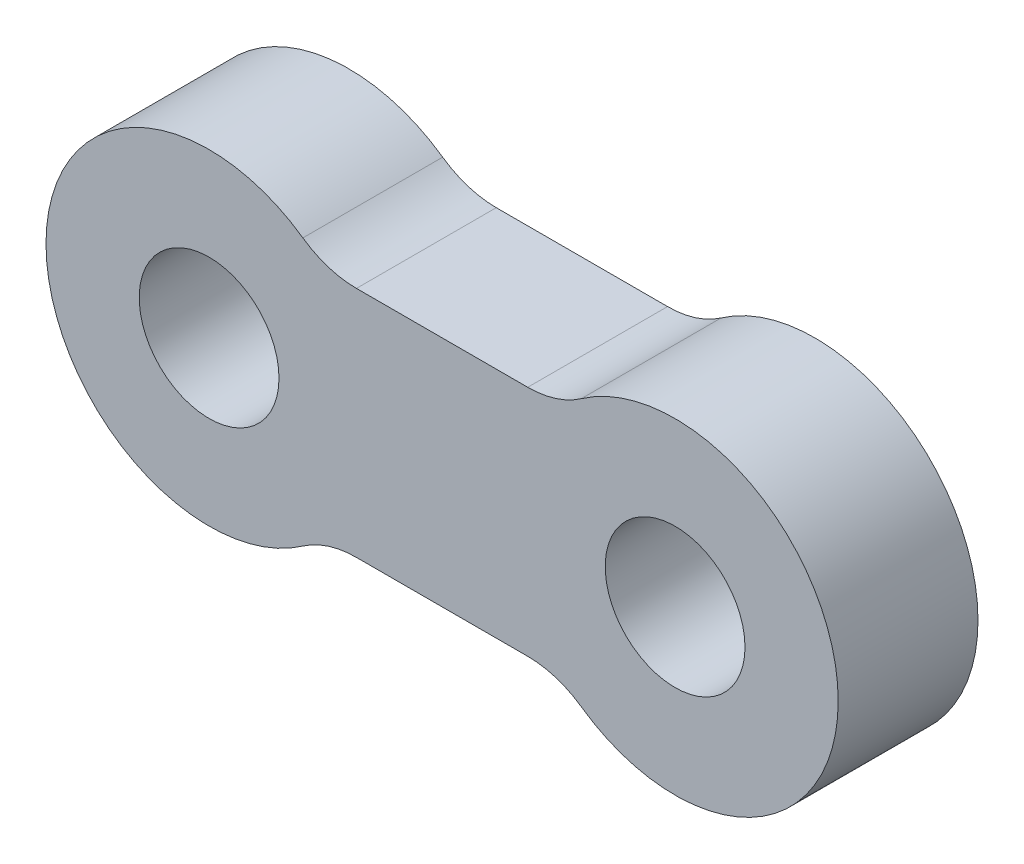
ISO-10303-21;
HEADER;
FILE_DESCRIPTION(('STEP AP214'),'2;1');
FILE_NAME('part.step','',(''),(''),'','','');
FILE_SCHEMA(('AUTOMOTIVE_DESIGN { 1 0 10303 214 1 1 1 1 }'));
ENDSEC;
DATA;
#1=APPLICATION_CONTEXT('core data for automotive mechanical design processes');
#2=APPLICATION_PROTOCOL_DEFINITION('international standard','automotive_design',2000,#1);
#3=PRODUCT_CONTEXT('',#1,'mechanical');
#4=PRODUCT('Part','Part','',(#3));
#5=PRODUCT_RELATED_PRODUCT_CATEGORY('part','',(#4));
#6=PRODUCT_DEFINITION_FORMATION('','',#4);
#7=PRODUCT_DEFINITION_CONTEXT('part definition',#1,'design');
#8=PRODUCT_DEFINITION('design','',#6,#7);
#9=PRODUCT_DEFINITION_SHAPE('','',#8);
#10=(LENGTH_UNIT() NAMED_UNIT(*) SI_UNIT(.MILLI.,.METRE.));
#11=(NAMED_UNIT(*) PLANE_ANGLE_UNIT() SI_UNIT($,.RADIAN.));
#12=(NAMED_UNIT(*) SI_UNIT($,.STERADIAN.) SOLID_ANGLE_UNIT());
#13=UNCERTAINTY_MEASURE_WITH_UNIT(LENGTH_MEASURE(1.E-05),#10,'distance_accuracy_value','');
#14=(GEOMETRIC_REPRESENTATION_CONTEXT(3) GLOBAL_UNCERTAINTY_ASSIGNED_CONTEXT((#13)) GLOBAL_UNIT_ASSIGNED_CONTEXT((#10,
#11,#12)) REPRESENTATION_CONTEXT('',''));
#15=CARTESIAN_POINT('',(0.,0.,0.));
#16=DIRECTION('',(0.,0.,1.));
#17=DIRECTION('',(1.,0.,0.));
#18=AXIS2_PLACEMENT_3D('',#15,#16,#17);
#19=CARTESIAN_POINT('',(0.,0.,3.));
#20=DIRECTION('',(0.,0.,1.));
#21=DIRECTION('',(1.,0.,0.));
#22=AXIS2_PLACEMENT_3D('',#19,#20,#21);
#23=PLANE('',#22);
#24=CARTESIAN_POINT('',(3.16227766016838,4.5,3.));
#25=DIRECTION('',(0.,0.,1.));
#26=DIRECTION('',(-1.,0.,0.));
#27=AXIS2_PLACEMENT_3D('',#24,#25,#26);
#28=CIRCLE('',#27,2.);
#29=CARTESIAN_POINT('',(2.01235851101624,2.86363636363636,3.));
#30=VERTEX_POINT('',#29);
#31=CARTESIAN_POINT('',(3.16227766016838,2.5,3.));
#32=VERTEX_POINT('',#31);
#33=EDGE_CURVE('E104',#30,#32,#28,.T.);
#34=ORIENTED_EDGE('',*,*,#33,.F.);
#35=CARTESIAN_POINT('',(0.,0.,3.));
#36=DIRECTION('',(0.,0.,1.));
#37=DIRECTION('',(1.,0.,0.));
#38=AXIS2_PLACEMENT_3D('',#35,#36,#37);
#39=CIRCLE('',#38,3.5);
#40=CARTESIAN_POINT('',(2.01235851101624,-2.86363636363637,3.));
#41=VERTEX_POINT('',#40);
#42=EDGE_CURVE('E44',#30,#41,#39,.T.);
#43=ORIENTED_EDGE('',*,*,#42,.T.);
#44=CARTESIAN_POINT('',(3.16227766016838,-4.5,3.));
#45=DIRECTION('',(0.,0.,1.));
#46=DIRECTION('',(1.,0.,0.));
#47=AXIS2_PLACEMENT_3D('',#44,#45,#46);
#48=CIRCLE('',#47,2.);
#49=CARTESIAN_POINT('',(3.16227766016838,-2.5,3.));
#50=VERTEX_POINT('',#49);
#51=EDGE_CURVE('E101',#50,#41,#48,.T.);
#52=ORIENTED_EDGE('',*,*,#51,.F.);
#53=DIRECTION('',(-1.,0.,0.));
#54=VECTOR('',#53,1.);
#55=CARTESIAN_POINT('',(3.16227766016838,-2.5,3.));
#56=LINE('',#55,#54);
#57=CARTESIAN_POINT('',(6.83772233983162,-2.5,3.));
#58=VERTEX_POINT('',#57);
#59=EDGE_CURVE('E117',#58,#50,#56,.T.);
#60=ORIENTED_EDGE('',*,*,#59,.F.);
#61=CARTESIAN_POINT('',(6.83772233983162,-4.5,3.));
#62=DIRECTION('',(0.,0.,1.));
#63=DIRECTION('',(1.,0.,0.));
#64=AXIS2_PLACEMENT_3D('',#61,#62,#63);
#65=CIRCLE('',#64,2.);
#66=CARTESIAN_POINT('',(7.98764148898376,-2.86363636363636,3.));
#67=VERTEX_POINT('',#66);
#68=EDGE_CURVE('E122',#67,#58,#65,.T.);
#69=ORIENTED_EDGE('',*,*,#68,.F.);
#70=CARTESIAN_POINT('',(10.,0.,3.));
#71=DIRECTION('',(0.,0.,1.));
#72=DIRECTION('',(1.,0.,0.));
#73=AXIS2_PLACEMENT_3D('',#70,#71,#72);
#74=CIRCLE('',#73,3.5);
#75=CARTESIAN_POINT('',(7.98764148898376,2.86363636363636,3.));
#76=VERTEX_POINT('',#75);
#77=EDGE_CURVE('E11',#67,#76,#74,.T.);
#78=ORIENTED_EDGE('',*,*,#77,.T.);
#79=CARTESIAN_POINT('',(6.83772233983162,4.5,3.));
#80=DIRECTION('',(0.,0.,1.));
#81=DIRECTION('',(-1.,0.,0.));
#82=AXIS2_PLACEMENT_3D('',#79,#80,#81);
#83=CIRCLE('',#82,2.);
#84=CARTESIAN_POINT('',(6.83772233983162,2.5,3.));
#85=VERTEX_POINT('',#84);
#86=EDGE_CURVE('E188',#85,#76,#83,.T.);
#87=ORIENTED_EDGE('',*,*,#86,.F.);
#88=DIRECTION('',(1.,0.,0.));
#89=VECTOR('',#88,1.);
#90=CARTESIAN_POINT('',(3.16227766016838,2.5,3.));
#91=LINE('',#90,#89);
#92=EDGE_CURVE('E192',#32,#85,#91,.T.);
#93=ORIENTED_EDGE('',*,*,#92,.F.);
#94=EDGE_LOOP('',(#34,#43,#52,#60,#69,#78,#87,#93));
#95=FACE_BOUND('',#94,.T.);
#96=CARTESIAN_POINT('',(0.,0.,3.));
#97=DIRECTION('',(0.,0.,1.));
#98=DIRECTION('',(1.,0.,0.));
#99=AXIS2_PLACEMENT_3D('',#96,#97,#98);
#100=CIRCLE('',#99,1.5);
#101=CARTESIAN_POINT('',(1.5,0.,3.));
#102=VERTEX_POINT('',#101);
#103=EDGE_CURVE('E141',#102,#102,#100,.T.);
#104=ORIENTED_EDGE('',*,*,#103,.F.);
#105=EDGE_LOOP('',(#104));
#106=FACE_BOUND('',#105,.T.);
#107=CARTESIAN_POINT('',(10.,0.,3.));
#108=DIRECTION('',(0.,0.,1.));
#109=DIRECTION('',(1.,0.,0.));
#110=AXIS2_PLACEMENT_3D('',#107,#108,#109);
#111=CIRCLE('',#110,1.5);
#112=CARTESIAN_POINT('',(11.5,0.,3.));
#113=VERTEX_POINT('',#112);
#114=EDGE_CURVE('E133',#113,#113,#111,.T.);
#115=ORIENTED_EDGE('',*,*,#114,.F.);
#116=EDGE_LOOP('',(#115));
#117=FACE_BOUND('',#116,.T.);
#118=ADVANCED_FACE('F34',(#95,#106,#117),#23,.T.);
#119=CARTESIAN_POINT('',(0.,0.,0.));
#120=DIRECTION('',(0.,0.,1.));
#121=DIRECTION('',(1.,0.,0.));
#122=AXIS2_PLACEMENT_3D('',#119,#120,#121);
#123=PLANE('',#122);
#124=CARTESIAN_POINT('',(0.,0.,0.));
#125=DIRECTION('',(0.,0.,1.));
#126=DIRECTION('',(1.,0.,0.));
#127=AXIS2_PLACEMENT_3D('',#124,#125,#126);
#128=CIRCLE('',#127,3.5);
#129=CARTESIAN_POINT('',(2.01235851101624,2.86363636363636,0.));
#130=VERTEX_POINT('',#129);
#131=CARTESIAN_POINT('',(2.01235851101624,-2.86363636363637,0.));
#132=VERTEX_POINT('',#131);
#133=EDGE_CURVE('E112',#130,#132,#128,.T.);
#134=ORIENTED_EDGE('',*,*,#133,.F.);
#135=CARTESIAN_POINT('',(3.16227766016838,4.5,0.));
#136=DIRECTION('',(0.,0.,1.));
#137=DIRECTION('',(-1.,0.,0.));
#138=AXIS2_PLACEMENT_3D('',#135,#136,#137);
#139=CIRCLE('',#138,2.);
#140=CARTESIAN_POINT('',(3.16227766016838,2.5,0.));
#141=VERTEX_POINT('',#140);
#142=EDGE_CURVE('E176',#130,#141,#139,.T.);
#143=ORIENTED_EDGE('',*,*,#142,.T.);
#144=DIRECTION('',(1.,0.,0.));
#145=VECTOR('',#144,1.);
#146=CARTESIAN_POINT('',(3.16227766016838,2.5,0.));
#147=LINE('',#146,#145);
#148=CARTESIAN_POINT('',(6.83772233983162,2.5,0.));
#149=VERTEX_POINT('',#148);
#150=EDGE_CURVE('E187',#141,#149,#147,.T.);
#151=ORIENTED_EDGE('',*,*,#150,.T.);
#152=CARTESIAN_POINT('',(6.83772233983162,4.5,0.));
#153=DIRECTION('',(0.,0.,1.));
#154=DIRECTION('',(-1.,0.,0.));
#155=AXIS2_PLACEMENT_3D('',#152,#153,#154);
#156=CIRCLE('',#155,2.);
#157=CARTESIAN_POINT('',(7.98764148898376,2.86363636363636,0.));
#158=VERTEX_POINT('',#157);
#159=EDGE_CURVE('E182',#149,#158,#156,.T.);
#160=ORIENTED_EDGE('',*,*,#159,.T.);
#161=CARTESIAN_POINT('',(10.,0.,0.));
#162=DIRECTION('',(0.,0.,1.));
#163=DIRECTION('',(1.,0.,0.));
#164=AXIS2_PLACEMENT_3D('',#161,#162,#163);
#165=CIRCLE('',#164,3.5);
#166=CARTESIAN_POINT('',(7.98764148898376,-2.86363636363636,0.));
#167=VERTEX_POINT('',#166);
#168=EDGE_CURVE('E38',#167,#158,#165,.T.);
#169=ORIENTED_EDGE('',*,*,#168,.F.);
#170=CARTESIAN_POINT('',(6.83772233983162,-4.5,0.));
#171=DIRECTION('',(0.,0.,1.));
#172=DIRECTION('',(1.,0.,0.));
#173=AXIS2_PLACEMENT_3D('',#170,#171,#172);
#174=CIRCLE('',#173,2.);
#175=CARTESIAN_POINT('',(6.83772233983162,-2.5,0.));
#176=VERTEX_POINT('',#175);
#177=EDGE_CURVE('E116',#167,#176,#174,.T.);
#178=ORIENTED_EDGE('',*,*,#177,.T.);
#179=DIRECTION('',(-1.,0.,0.));
#180=VECTOR('',#179,1.);
#181=CARTESIAN_POINT('',(3.16227766016838,-2.5,0.));
#182=LINE('',#181,#180);
#183=CARTESIAN_POINT('',(3.16227766016838,-2.5,0.));
#184=VERTEX_POINT('',#183);
#185=EDGE_CURVE('E120',#176,#184,#182,.T.);
#186=ORIENTED_EDGE('',*,*,#185,.T.);
#187=CARTESIAN_POINT('',(3.16227766016838,-4.5,0.));
#188=DIRECTION('',(0.,0.,1.));
#189=DIRECTION('',(1.,0.,0.));
#190=AXIS2_PLACEMENT_3D('',#187,#188,#189);
#191=CIRCLE('',#190,2.);
#192=EDGE_CURVE('E132',#184,#132,#191,.T.);
#193=ORIENTED_EDGE('',*,*,#192,.T.);
#194=EDGE_LOOP('',(#134,#143,#151,#160,#169,#178,#186,#193));
#195=FACE_BOUND('',#194,.T.);
#196=CARTESIAN_POINT('',(0.,0.,0.));
#197=DIRECTION('',(0.,0.,1.));
#198=DIRECTION('',(1.,0.,0.));
#199=AXIS2_PLACEMENT_3D('',#196,#197,#198);
#200=CIRCLE('',#199,1.5);
#201=CARTESIAN_POINT('',(1.5,0.,0.));
#202=VERTEX_POINT('',#201);
#203=EDGE_CURVE('E136',#202,#202,#200,.T.);
#204=ORIENTED_EDGE('',*,*,#203,.T.);
#205=EDGE_LOOP('',(#204));
#206=FACE_BOUND('',#205,.T.);
#207=CARTESIAN_POINT('',(10.,0.,0.));
#208=DIRECTION('',(0.,0.,1.));
#209=DIRECTION('',(1.,0.,0.));
#210=AXIS2_PLACEMENT_3D('',#207,#208,#209);
#211=CIRCLE('',#210,1.5);
#212=CARTESIAN_POINT('',(11.5,0.,0.));
#213=VERTEX_POINT('',#212);
#214=EDGE_CURVE('E137',#213,#213,#211,.T.);
#215=ORIENTED_EDGE('',*,*,#214,.T.);
#216=EDGE_LOOP('',(#215));
#217=FACE_BOUND('',#216,.T.);
#218=ADVANCED_FACE('F147',(#195,#206,#217),#123,.F.);
#219=CARTESIAN_POINT('',(0.,0.,3.));
#220=DIRECTION('',(0.,0.,-1.));
#221=DIRECTION('',(-1.,0.,0.));
#222=AXIS2_PLACEMENT_3D('',#219,#220,#221);
#223=CYLINDRICAL_SURFACE('',#222,3.5);
#224=ORIENTED_EDGE('',*,*,#133,.T.);
#225=DIRECTION('',(0.,0.,1.));
#226=VECTOR('',#225,1.);
#227=CARTESIAN_POINT('',(2.01235851101624,-2.86363636363637,0.));
#228=LINE('',#227,#226);
#229=EDGE_CURVE('E110',#132,#41,#228,.T.);
#230=ORIENTED_EDGE('',*,*,#229,.T.);
#231=ORIENTED_EDGE('',*,*,#42,.F.);
#232=DIRECTION('',(0.,0.,1.));
#233=VECTOR('',#232,1.);
#234=CARTESIAN_POINT('',(2.01235851101624,2.86363636363636,0.));
#235=LINE('',#234,#233);
#236=EDGE_CURVE('E179',#130,#30,#235,.T.);
#237=ORIENTED_EDGE('',*,*,#236,.F.);
#238=EDGE_LOOP('',(#224,#230,#231,#237));
#239=FACE_BOUND('',#238,.T.);
#240=ADVANCED_FACE('F36',(#239),#223,.T.);
#241=CARTESIAN_POINT('',(10.,0.,3.));
#242=DIRECTION('',(0.,0.,-1.));
#243=DIRECTION('',(-1.,0.,0.));
#244=AXIS2_PLACEMENT_3D('',#241,#242,#243);
#245=CYLINDRICAL_SURFACE('',#244,3.5);
#246=ORIENTED_EDGE('',*,*,#168,.T.);
#247=DIRECTION('',(0.,0.,1.));
#248=VECTOR('',#247,1.);
#249=CARTESIAN_POINT('',(7.98764148898376,2.86363636363636,0.));
#250=LINE('',#249,#248);
#251=EDGE_CURVE('E140',#158,#76,#250,.T.);
#252=ORIENTED_EDGE('',*,*,#251,.T.);
#253=ORIENTED_EDGE('',*,*,#77,.F.);
#254=DIRECTION('',(0.,0.,1.));
#255=VECTOR('',#254,1.);
#256=CARTESIAN_POINT('',(7.98764148898376,-2.86363636363636,0.));
#257=LINE('',#256,#255);
#258=EDGE_CURVE('E129',#167,#67,#257,.T.);
#259=ORIENTED_EDGE('',*,*,#258,.F.);
#260=EDGE_LOOP('',(#246,#252,#253,#259));
#261=FACE_BOUND('',#260,.T.);
#262=ADVANCED_FACE('F153',(#261),#245,.T.);
#263=CARTESIAN_POINT('',(0.,0.,3.));
#264=DIRECTION('',(0.,0.,-1.));
#265=DIRECTION('',(-1.,0.,0.));
#266=AXIS2_PLACEMENT_3D('',#263,#264,#265);
#267=CYLINDRICAL_SURFACE('',#266,1.5);
#268=ORIENTED_EDGE('',*,*,#103,.T.);
#269=EDGE_LOOP('',(#268));
#270=FACE_BOUND('',#269,.T.);
#271=ORIENTED_EDGE('',*,*,#203,.F.);
#272=EDGE_LOOP('',(#271));
#273=FACE_BOUND('',#272,.T.);
#274=ADVANCED_FACE('F150',(#270,#273),#267,.F.);
#275=CARTESIAN_POINT('',(10.,0.,3.));
#276=DIRECTION('',(0.,0.,-1.));
#277=DIRECTION('',(-1.,0.,0.));
#278=AXIS2_PLACEMENT_3D('',#275,#276,#277);
#279=CYLINDRICAL_SURFACE('',#278,1.5);
#280=ORIENTED_EDGE('',*,*,#114,.T.);
#281=EDGE_LOOP('',(#280));
#282=FACE_BOUND('',#281,.T.);
#283=ORIENTED_EDGE('',*,*,#214,.F.);
#284=EDGE_LOOP('',(#283));
#285=FACE_BOUND('',#284,.T.);
#286=ADVANCED_FACE('F152',(#282,#285),#279,.F.);
#287=CARTESIAN_POINT('',(6.83772233983162,4.5,0.));
#288=DIRECTION('',(0.,0.,1.));
#289=DIRECTION('',(1.,0.,0.));
#290=AXIS2_PLACEMENT_3D('',#287,#288,#289);
#291=CYLINDRICAL_SURFACE('',#290,2.);
#292=ORIENTED_EDGE('',*,*,#86,.T.);
#293=ORIENTED_EDGE('',*,*,#251,.F.);
#294=ORIENTED_EDGE('',*,*,#159,.F.);
#295=DIRECTION('',(0.,0.,1.));
#296=VECTOR('',#295,1.);
#297=CARTESIAN_POINT('',(6.83772233983162,2.5,0.));
#298=LINE('',#297,#296);
#299=EDGE_CURVE('E201',#149,#85,#298,.T.);
#300=ORIENTED_EDGE('',*,*,#299,.T.);
#301=EDGE_LOOP('',(#292,#293,#294,#300));
#302=FACE_BOUND('',#301,.T.);
#303=ADVANCED_FACE('F160',(#302),#291,.F.);
#304=CARTESIAN_POINT('',(3.16227766016838,2.5,0.));
#305=DIRECTION('',(0.,-1.,0.));
#306=DIRECTION('',(1.,0.,0.));
#307=AXIS2_PLACEMENT_3D('',#304,#305,#306);
#308=PLANE('',#307);
#309=ORIENTED_EDGE('',*,*,#92,.T.);
#310=ORIENTED_EDGE('',*,*,#299,.F.);
#311=ORIENTED_EDGE('',*,*,#150,.F.);
#312=DIRECTION('',(0.,0.,1.));
#313=VECTOR('',#312,1.);
#314=CARTESIAN_POINT('',(3.16227766016838,2.5,0.));
#315=LINE('',#314,#313);
#316=EDGE_CURVE('E181',#141,#32,#315,.T.);
#317=ORIENTED_EDGE('',*,*,#316,.T.);
#318=EDGE_LOOP('',(#309,#310,#311,#317));
#319=FACE_BOUND('',#318,.T.);
#320=ADVANCED_FACE('F217',(#319),#308,.F.);
#321=CARTESIAN_POINT('',(3.16227766016838,4.5,0.));
#322=DIRECTION('',(0.,0.,1.));
#323=DIRECTION('',(1.,0.,0.));
#324=AXIS2_PLACEMENT_3D('',#321,#322,#323);
#325=CYLINDRICAL_SURFACE('',#324,2.);
#326=ORIENTED_EDGE('',*,*,#33,.T.);
#327=ORIENTED_EDGE('',*,*,#316,.F.);
#328=ORIENTED_EDGE('',*,*,#142,.F.);
#329=ORIENTED_EDGE('',*,*,#236,.T.);
#330=EDGE_LOOP('',(#326,#327,#328,#329));
#331=FACE_BOUND('',#330,.T.);
#332=ADVANCED_FACE('F185',(#331),#325,.F.);
#333=CARTESIAN_POINT('',(3.16227766016838,-4.5,0.));
#334=DIRECTION('',(0.,0.,1.));
#335=DIRECTION('',(1.,0.,0.));
#336=AXIS2_PLACEMENT_3D('',#333,#334,#335);
#337=CYLINDRICAL_SURFACE('',#336,2.);
#338=ORIENTED_EDGE('',*,*,#51,.T.);
#339=ORIENTED_EDGE('',*,*,#229,.F.);
#340=ORIENTED_EDGE('',*,*,#192,.F.);
#341=DIRECTION('',(0.,0.,1.));
#342=VECTOR('',#341,1.);
#343=CARTESIAN_POINT('',(3.16227766016838,-2.5,0.));
#344=LINE('',#343,#342);
#345=EDGE_CURVE('E92',#184,#50,#344,.T.);
#346=ORIENTED_EDGE('',*,*,#345,.T.);
#347=EDGE_LOOP('',(#338,#339,#340,#346));
#348=FACE_BOUND('',#347,.T.);
#349=ADVANCED_FACE('F115',(#348),#337,.F.);
#350=CARTESIAN_POINT('',(3.16227766016838,-2.5,0.));
#351=DIRECTION('',(0.,1.,0.));
#352=DIRECTION('',(-1.,0.,0.));
#353=AXIS2_PLACEMENT_3D('',#350,#351,#352);
#354=PLANE('',#353);
#355=ORIENTED_EDGE('',*,*,#59,.T.);
#356=ORIENTED_EDGE('',*,*,#345,.F.);
#357=ORIENTED_EDGE('',*,*,#185,.F.);
#358=DIRECTION('',(0.,0.,1.));
#359=VECTOR('',#358,1.);
#360=CARTESIAN_POINT('',(6.83772233983162,-2.5,0.));
#361=LINE('',#360,#359);
#362=EDGE_CURVE('E127',#176,#58,#361,.T.);
#363=ORIENTED_EDGE('',*,*,#362,.T.);
#364=EDGE_LOOP('',(#355,#356,#357,#363));
#365=FACE_BOUND('',#364,.T.);
#366=ADVANCED_FACE('F212',(#365),#354,.F.);
#367=CARTESIAN_POINT('',(6.83772233983162,-4.5,0.));
#368=DIRECTION('',(0.,0.,1.));
#369=DIRECTION('',(1.,0.,0.));
#370=AXIS2_PLACEMENT_3D('',#367,#368,#369);
#371=CYLINDRICAL_SURFACE('',#370,2.);
#372=ORIENTED_EDGE('',*,*,#68,.T.);
#373=ORIENTED_EDGE('',*,*,#362,.F.);
#374=ORIENTED_EDGE('',*,*,#177,.F.);
#375=ORIENTED_EDGE('',*,*,#258,.T.);
#376=EDGE_LOOP('',(#372,#373,#374,#375));
#377=FACE_BOUND('',#376,.T.);
#378=ADVANCED_FACE('F208',(#377),#371,.F.);
#379=CLOSED_SHELL('',(#118,#218,#240,#262,#274,#286,#303,#320,#332,#349,#366,#378));
#380=MANIFOLD_SOLID_BREP('B2',#379);
#381=ADVANCED_BREP_SHAPE_REPRESENTATION('',(#18,#380),#14);
#382=SHAPE_DEFINITION_REPRESENTATION(#9,#381);
ENDSEC;
END-ISO-10303-21;
